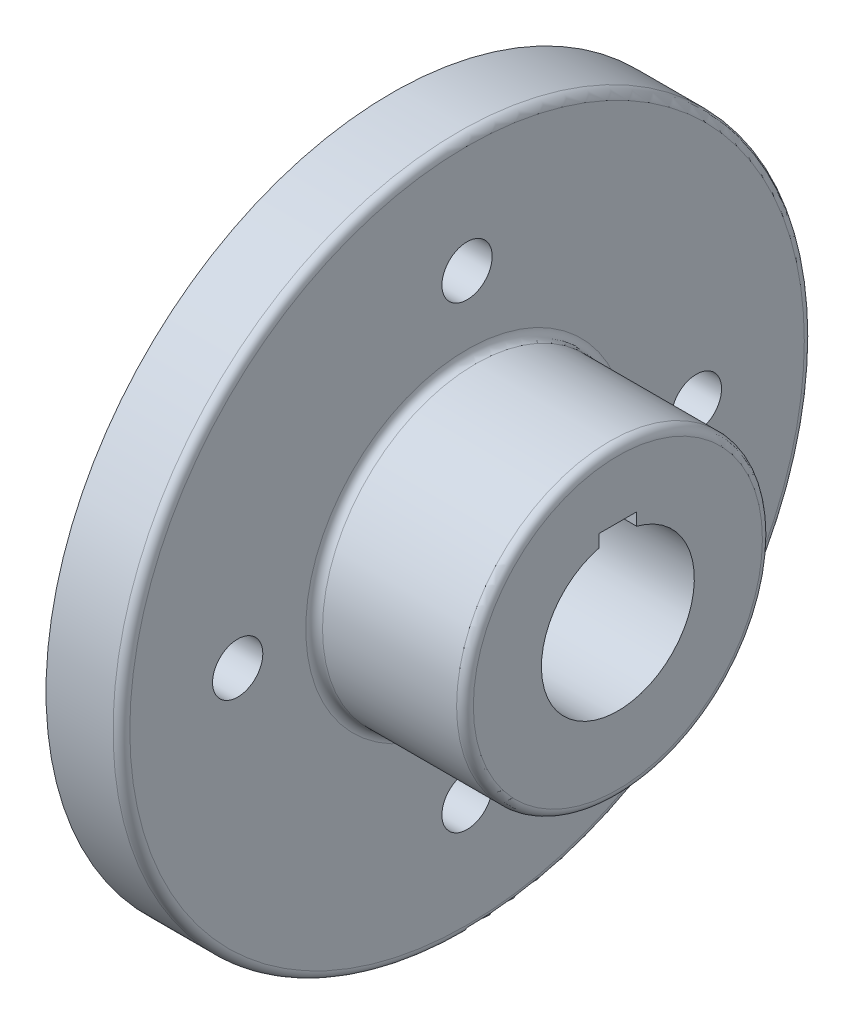
ISO-10303-21;
HEADER;
FILE_DESCRIPTION(('STEP AP214'),'2;1');
FILE_NAME('part.step','',(''),(''),'','','');
FILE_SCHEMA(('AUTOMOTIVE_DESIGN { 1 0 10303 214 1 1 1 1 }'));
ENDSEC;
DATA;
#1=APPLICATION_CONTEXT('core data for automotive mechanical design processes');
#2=APPLICATION_PROTOCOL_DEFINITION('international standard','automotive_design',2000,#1);
#3=PRODUCT_CONTEXT('',#1,'mechanical');
#4=PRODUCT('Part','Part','',(#3));
#5=PRODUCT_RELATED_PRODUCT_CATEGORY('part','',(#4));
#6=PRODUCT_DEFINITION_FORMATION('','',#4);
#7=PRODUCT_DEFINITION_CONTEXT('part definition',#1,'design');
#8=PRODUCT_DEFINITION('design','',#6,#7);
#9=PRODUCT_DEFINITION_SHAPE('','',#8);
#10=(LENGTH_UNIT() NAMED_UNIT(*) SI_UNIT(.MILLI.,.METRE.));
#11=(NAMED_UNIT(*) PLANE_ANGLE_UNIT() SI_UNIT($,.RADIAN.));
#12=(NAMED_UNIT(*) SI_UNIT($,.STERADIAN.) SOLID_ANGLE_UNIT());
#13=UNCERTAINTY_MEASURE_WITH_UNIT(LENGTH_MEASURE(1.E-05),#10,'distance_accuracy_value','');
#14=(GEOMETRIC_REPRESENTATION_CONTEXT(3) GLOBAL_UNCERTAINTY_ASSIGNED_CONTEXT((#13)) GLOBAL_UNIT_ASSIGNED_CONTEXT((#10,
#11,#12)) REPRESENTATION_CONTEXT('',''));
#15=CARTESIAN_POINT('',(0.,0.,0.));
#16=DIRECTION('',(0.,0.,1.));
#17=DIRECTION('',(1.,0.,0.));
#18=AXIS2_PLACEMENT_3D('',#15,#16,#17);
#19=CARTESIAN_POINT('',(18.,0.,0.));
#20=DIRECTION('',(-1.,0.,0.));
#21=DIRECTION('',(0.,0.,1.));
#22=AXIS2_PLACEMENT_3D('',#19,#20,#21);
#23=CYLINDRICAL_SURFACE('',#22,82.5);
#24=CARTESIAN_POINT('',(16.,0.,0.));
#25=DIRECTION('',(1.,0.,0.));
#26=DIRECTION('',(0.,0.,-1.));
#27=AXIS2_PLACEMENT_3D('',#24,#25,#26);
#28=CIRCLE('',#27,82.5);
#29=CARTESIAN_POINT('',(16.,0.,-82.5));
#30=VERTEX_POINT('',#29);
#31=EDGE_CURVE('E132',#30,#30,#28,.F.);
#32=ORIENTED_EDGE('',*,*,#31,.T.);
#33=EDGE_LOOP('',(#32));
#34=FACE_BOUND('',#33,.T.);
#35=CARTESIAN_POINT('',(0.,0.,0.));
#36=DIRECTION('',(1.,0.,0.));
#37=DIRECTION('',(0.,0.,-1.));
#38=AXIS2_PLACEMENT_3D('',#35,#36,#37);
#39=CIRCLE('',#38,82.5);
#40=CARTESIAN_POINT('',(0.,0.,-82.5));
#41=VERTEX_POINT('',#40);
#42=EDGE_CURVE('E113',#41,#41,#39,.T.);
#43=ORIENTED_EDGE('',*,*,#42,.T.);
#44=EDGE_LOOP('',(#43));
#45=FACE_BOUND('',#44,.T.);
#46=ADVANCED_FACE('F43',(#34,#45),#23,.T.);
#47=CARTESIAN_POINT('',(18.,0.,0.));
#48=DIRECTION('',(1.,0.,0.));
#49=DIRECTION('',(0.,0.,-1.));
#50=AXIS2_PLACEMENT_3D('',#47,#48,#49);
#51=PLANE('',#50);
#52=CARTESIAN_POINT('',(18.,0.,0.));
#53=DIRECTION('',(1.,0.,0.));
#54=DIRECTION('',(0.,0.,-1.));
#55=AXIS2_PLACEMENT_3D('',#52,#53,#54);
#56=CIRCLE('',#55,80.5);
#57=CARTESIAN_POINT('',(18.,0.,-80.5));
#58=VERTEX_POINT('',#57);
#59=EDGE_CURVE('E128',#58,#58,#56,.T.);
#60=ORIENTED_EDGE('',*,*,#59,.T.);
#61=EDGE_LOOP('',(#60));
#62=FACE_BOUND('',#61,.T.);
#63=CARTESIAN_POINT('',(18.,0.,0.));
#64=DIRECTION('',(1.,0.,0.));
#65=DIRECTION('',(0.,0.,-1.));
#66=AXIS2_PLACEMENT_3D('',#63,#64,#65);
#67=CIRCLE('',#66,38.5);
#68=CARTESIAN_POINT('',(18.,0.,-38.5));
#69=VERTEX_POINT('',#68);
#70=EDGE_CURVE('E118',#69,#69,#67,.F.);
#71=ORIENTED_EDGE('',*,*,#70,.T.);
#72=EDGE_LOOP('',(#71));
#73=FACE_BOUND('',#72,.T.);
#74=CARTESIAN_POINT('',(18.,-54.75,0.));
#75=DIRECTION('',(1.,0.,0.));
#76=DIRECTION('',(0.,0.,-1.));
#77=AXIS2_PLACEMENT_3D('',#74,#75,#76);
#78=CIRCLE('',#77,6.);
#79=CARTESIAN_POINT('',(18.,-54.75,-5.99999999999999));
#80=VERTEX_POINT('',#79);
#81=EDGE_CURVE('E120',#80,#80,#78,.T.);
#82=ORIENTED_EDGE('',*,*,#81,.F.);
#83=EDGE_LOOP('',(#82));
#84=FACE_BOUND('',#83,.T.);
#85=CARTESIAN_POINT('',(18.,1.8445366207633E-13,-54.75));
#86=DIRECTION('',(1.,0.,0.));
#87=DIRECTION('',(0.,0.,-1.));
#88=AXIS2_PLACEMENT_3D('',#85,#86,#87);
#89=CIRCLE('',#88,6.);
#90=CARTESIAN_POINT('',(18.,1.8445366207633E-13,-60.75));
#91=VERTEX_POINT('',#90);
#92=EDGE_CURVE('E246',#91,#91,#89,.T.);
#93=ORIENTED_EDGE('',*,*,#92,.F.);
#94=EDGE_LOOP('',(#93));
#95=FACE_BOUND('',#94,.T.);
#96=CARTESIAN_POINT('',(18.,54.75,3.75612265377991E-13));
#97=DIRECTION('',(1.,0.,0.));
#98=DIRECTION('',(0.,0.,-1.));
#99=AXIS2_PLACEMENT_3D('',#96,#97,#98);
#100=CIRCLE('',#99,6.);
#101=CARTESIAN_POINT('',(18.,54.75,-5.99999999999962));
#102=VERTEX_POINT('',#101);
#103=EDGE_CURVE('E243',#102,#102,#100,.T.);
#104=ORIENTED_EDGE('',*,*,#103,.F.);
#105=EDGE_LOOP('',(#104));
#106=FACE_BOUND('',#105,.T.);
#107=CARTESIAN_POINT('',(18.,-5.66770868679653E-13,54.75));
#108=DIRECTION('',(1.,0.,0.));
#109=DIRECTION('',(0.,0.,-1.));
#110=AXIS2_PLACEMENT_3D('',#107,#108,#109);
#111=CIRCLE('',#110,6.);
#112=CARTESIAN_POINT('',(18.,-5.66770868679653E-13,48.75));
#113=VERTEX_POINT('',#112);
#114=EDGE_CURVE('E228',#113,#113,#111,.T.);
#115=ORIENTED_EDGE('',*,*,#114,.F.);
#116=EDGE_LOOP('',(#115));
#117=FACE_BOUND('',#116,.T.);
#118=ADVANCED_FACE('F161',(#62,#73,#84,#95,#106,#117),#51,.T.);
#119=CARTESIAN_POINT('',(0.,0.,0.));
#120=DIRECTION('',(1.,0.,0.));
#121=DIRECTION('',(0.,0.,-1.));
#122=AXIS2_PLACEMENT_3D('',#119,#120,#121);
#123=PLANE('',#122);
#124=CARTESIAN_POINT('',(0.,-54.75,0.));
#125=DIRECTION('',(-1.,0.,0.));
#126=DIRECTION('',(0.,0.,1.));
#127=AXIS2_PLACEMENT_3D('',#124,#125,#126);
#128=CIRCLE('',#127,6.);
#129=CARTESIAN_POINT('',(0.,-54.75,6.00000000000001));
#130=VERTEX_POINT('',#129);
#131=EDGE_CURVE('E224',#130,#130,#128,.T.);
#132=ORIENTED_EDGE('',*,*,#131,.F.);
#133=EDGE_LOOP('',(#132));
#134=FACE_BOUND('',#133,.T.);
#135=CARTESIAN_POINT('',(0.,1.8445366207633E-13,-54.75));
#136=DIRECTION('',(-1.,0.,0.));
#137=DIRECTION('',(0.,0.,1.));
#138=AXIS2_PLACEMENT_3D('',#135,#136,#137);
#139=CIRCLE('',#138,6.);
#140=CARTESIAN_POINT('',(0.,1.8445366207633E-13,-48.75));
#141=VERTEX_POINT('',#140);
#142=EDGE_CURVE('E229',#141,#141,#139,.T.);
#143=ORIENTED_EDGE('',*,*,#142,.F.);
#144=EDGE_LOOP('',(#143));
#145=FACE_BOUND('',#144,.T.);
#146=CARTESIAN_POINT('',(0.,54.75,3.75612265377991E-13));
#147=DIRECTION('',(-1.,0.,0.));
#148=DIRECTION('',(0.,0.,1.));
#149=AXIS2_PLACEMENT_3D('',#146,#147,#148);
#150=CIRCLE('',#149,6.);
#151=CARTESIAN_POINT('',(0.,54.75,6.00000000000037));
#152=VERTEX_POINT('',#151);
#153=EDGE_CURVE('E233',#152,#152,#150,.T.);
#154=ORIENTED_EDGE('',*,*,#153,.F.);
#155=EDGE_LOOP('',(#154));
#156=FACE_BOUND('',#155,.T.);
#157=CARTESIAN_POINT('',(0.,-5.66770868679653E-13,54.75));
#158=DIRECTION('',(-1.,0.,0.));
#159=DIRECTION('',(0.,0.,1.));
#160=AXIS2_PLACEMENT_3D('',#157,#158,#159);
#161=CIRCLE('',#160,6.);
#162=CARTESIAN_POINT('',(0.,-5.66770868679653E-13,60.75));
#163=VERTEX_POINT('',#162);
#164=EDGE_CURVE('E219',#163,#163,#161,.T.);
#165=ORIENTED_EDGE('',*,*,#164,.F.);
#166=EDGE_LOOP('',(#165));
#167=FACE_BOUND('',#166,.T.);
#168=CARTESIAN_POINT('',(0.,0.,0.));
#169=DIRECTION('',(-1.,0.,0.));
#170=DIRECTION('',(0.,0.,1.));
#171=AXIS2_PLACEMENT_3D('',#168,#169,#170);
#172=CIRCLE('',#171,18.25);
#173=CARTESIAN_POINT('',(0.,17.686506155824,-4.50000000000001));
#174=VERTEX_POINT('',#173);
#175=CARTESIAN_POINT('',(0.,17.686506155824,4.5));
#176=VERTEX_POINT('',#175);
#177=EDGE_CURVE('E107',#174,#176,#172,.T.);
#178=ORIENTED_EDGE('',*,*,#177,.F.);
#179=DIRECTION('',(0.,-1.,0.));
#180=VECTOR('',#179,1.);
#181=CARTESIAN_POINT('',(0.,20.686506155824,-4.5));
#182=LINE('',#181,#180);
#183=CARTESIAN_POINT('',(0.,20.686506155824,-4.5));
#184=VERTEX_POINT('',#183);
#185=EDGE_CURVE('E59',#184,#174,#182,.T.);
#186=ORIENTED_EDGE('',*,*,#185,.F.);
#187=DIRECTION('',(0.,0.,-1.));
#188=VECTOR('',#187,1.);
#189=CARTESIAN_POINT('',(0.,20.686506155824,-4.5));
#190=LINE('',#189,#188);
#191=CARTESIAN_POINT('',(0.,20.686506155824,4.5));
#192=VERTEX_POINT('',#191);
#193=EDGE_CURVE('E205',#192,#184,#190,.T.);
#194=ORIENTED_EDGE('',*,*,#193,.F.);
#195=DIRECTION('',(0.,1.,0.));
#196=VECTOR('',#195,1.);
#197=CARTESIAN_POINT('',(0.,20.686506155824,4.5));
#198=LINE('',#197,#196);
#199=EDGE_CURVE('E208',#176,#192,#198,.T.);
#200=ORIENTED_EDGE('',*,*,#199,.F.);
#201=EDGE_LOOP('',(#178,#186,#194,#200));
#202=FACE_BOUND('',#201,.T.);
#203=ORIENTED_EDGE('',*,*,#42,.F.);
#204=EDGE_LOOP('',(#203));
#205=FACE_BOUND('',#204,.T.);
#206=ADVANCED_FACE('F167',(#134,#145,#156,#167,#202,#205),#123,.F.);
#207=CARTESIAN_POINT('',(54.,0.,0.));
#208=DIRECTION('',(-1.,0.,0.));
#209=DIRECTION('',(0.,0.,1.));
#210=AXIS2_PLACEMENT_3D('',#207,#208,#209);
#211=CYLINDRICAL_SURFACE('',#210,36.5);
#212=CARTESIAN_POINT('',(20.,0.,0.));
#213=DIRECTION('',(1.,0.,0.));
#214=DIRECTION('',(0.,0.,-1.));
#215=AXIS2_PLACEMENT_3D('',#212,#213,#214);
#216=CIRCLE('',#215,36.5);
#217=CARTESIAN_POINT('',(20.,0.,-36.5));
#218=VERTEX_POINT('',#217);
#219=EDGE_CURVE('E52',#218,#218,#216,.T.);
#220=ORIENTED_EDGE('',*,*,#219,.T.);
#221=EDGE_LOOP('',(#220));
#222=FACE_BOUND('',#221,.T.);
#223=CARTESIAN_POINT('',(52.,0.,0.));
#224=DIRECTION('',(1.,0.,0.));
#225=DIRECTION('',(0.,0.,-1.));
#226=AXIS2_PLACEMENT_3D('',#223,#224,#225);
#227=CIRCLE('',#226,36.5);
#228=CARTESIAN_POINT('',(52.,0.,-36.5));
#229=VERTEX_POINT('',#228);
#230=EDGE_CURVE('E136',#229,#229,#227,.F.);
#231=ORIENTED_EDGE('',*,*,#230,.T.);
#232=EDGE_LOOP('',(#231));
#233=FACE_BOUND('',#232,.T.);
#234=ADVANCED_FACE('F143',(#222,#233),#211,.T.);
#235=CARTESIAN_POINT('',(54.,0.,0.));
#236=DIRECTION('',(1.,0.,0.));
#237=DIRECTION('',(0.,0.,-1.));
#238=AXIS2_PLACEMENT_3D('',#235,#236,#237);
#239=PLANE('',#238);
#240=DIRECTION('',(0.,-1.,0.));
#241=VECTOR('',#240,1.);
#242=CARTESIAN_POINT('',(54.,20.686506155824,-4.5));
#243=LINE('',#242,#241);
#244=CARTESIAN_POINT('',(54.,20.686506155824,-4.5));
#245=VERTEX_POINT('',#244);
#246=CARTESIAN_POINT('',(54.,17.686506155824,-4.5));
#247=VERTEX_POINT('',#246);
#248=EDGE_CURVE('E99',#245,#247,#243,.T.);
#249=ORIENTED_EDGE('',*,*,#248,.T.);
#250=CARTESIAN_POINT('',(54.,0.,0.));
#251=DIRECTION('',(-1.,0.,0.));
#252=DIRECTION('',(0.,0.,1.));
#253=AXIS2_PLACEMENT_3D('',#250,#251,#252);
#254=CIRCLE('',#253,18.25);
#255=CARTESIAN_POINT('',(54.,17.686506155824,4.5));
#256=VERTEX_POINT('',#255);
#257=EDGE_CURVE('E105',#247,#256,#254,.T.);
#258=ORIENTED_EDGE('',*,*,#257,.T.);
#259=DIRECTION('',(0.,1.,0.));
#260=VECTOR('',#259,1.);
#261=CARTESIAN_POINT('',(54.,20.686506155824,4.5));
#262=LINE('',#261,#260);
#263=CARTESIAN_POINT('',(54.,20.686506155824,4.5));
#264=VERTEX_POINT('',#263);
#265=EDGE_CURVE('E87',#256,#264,#262,.T.);
#266=ORIENTED_EDGE('',*,*,#265,.T.);
#267=DIRECTION('',(0.,0.,-1.));
#268=VECTOR('',#267,1.);
#269=CARTESIAN_POINT('',(54.,20.686506155824,-4.5));
#270=LINE('',#269,#268);
#271=EDGE_CURVE('E98',#264,#245,#270,.T.);
#272=ORIENTED_EDGE('',*,*,#271,.T.);
#273=EDGE_LOOP('',(#249,#258,#266,#272));
#274=FACE_BOUND('',#273,.T.);
#275=CARTESIAN_POINT('',(54.,0.,0.));
#276=DIRECTION('',(1.,0.,0.));
#277=DIRECTION('',(0.,0.,-1.));
#278=AXIS2_PLACEMENT_3D('',#275,#276,#277);
#279=CIRCLE('',#278,34.5);
#280=CARTESIAN_POINT('',(54.,0.,-34.5));
#281=VERTEX_POINT('',#280);
#282=EDGE_CURVE('E11',#281,#281,#279,.T.);
#283=ORIENTED_EDGE('',*,*,#282,.T.);
#284=EDGE_LOOP('',(#283));
#285=FACE_BOUND('',#284,.T.);
#286=ADVANCED_FACE('F110',(#274,#285),#239,.T.);
#287=CARTESIAN_POINT('',(54.,0.,0.));
#288=DIRECTION('',(-1.,0.,0.));
#289=DIRECTION('',(0.,0.,1.));
#290=AXIS2_PLACEMENT_3D('',#287,#288,#289);
#291=CYLINDRICAL_SURFACE('',#290,18.25);
#292=ORIENTED_EDGE('',*,*,#177,.T.);
#293=DIRECTION('',(-1.,0.,0.));
#294=VECTOR('',#293,1.);
#295=CARTESIAN_POINT('',(54.,17.686506155824,4.5));
#296=LINE('',#295,#294);
#297=EDGE_CURVE('E91',#256,#176,#296,.T.);
#298=ORIENTED_EDGE('',*,*,#297,.F.);
#299=ORIENTED_EDGE('',*,*,#257,.F.);
#300=DIRECTION('',(-1.,0.,0.));
#301=VECTOR('',#300,1.);
#302=CARTESIAN_POINT('',(54.,17.686506155824,-4.5));
#303=LINE('',#302,#301);
#304=EDGE_CURVE('E82',#247,#174,#303,.T.);
#305=ORIENTED_EDGE('',*,*,#304,.T.);
#306=EDGE_LOOP('',(#292,#298,#299,#305));
#307=FACE_BOUND('',#306,.T.);
#308=ADVANCED_FACE('F104',(#307),#291,.F.);
#309=CARTESIAN_POINT('',(54.,-5.66770868679653E-13,54.75));
#310=DIRECTION('',(-1.,0.,0.));
#311=DIRECTION('',(0.,0.,1.));
#312=AXIS2_PLACEMENT_3D('',#309,#310,#311);
#313=CYLINDRICAL_SURFACE('',#312,6.);
#314=ORIENTED_EDGE('',*,*,#114,.T.);
#315=EDGE_LOOP('',(#314));
#316=FACE_BOUND('',#315,.T.);
#317=ORIENTED_EDGE('',*,*,#164,.T.);
#318=EDGE_LOOP('',(#317));
#319=FACE_BOUND('',#318,.T.);
#320=ADVANCED_FACE('F181',(#316,#319),#313,.F.);
#321=CARTESIAN_POINT('',(54.,54.75,3.75612265377991E-13));
#322=DIRECTION('',(-1.,0.,0.));
#323=DIRECTION('',(0.,0.,1.));
#324=AXIS2_PLACEMENT_3D('',#321,#322,#323);
#325=CYLINDRICAL_SURFACE('',#324,6.);
#326=ORIENTED_EDGE('',*,*,#103,.T.);
#327=EDGE_LOOP('',(#326));
#328=FACE_BOUND('',#327,.T.);
#329=ORIENTED_EDGE('',*,*,#153,.T.);
#330=EDGE_LOOP('',(#329));
#331=FACE_BOUND('',#330,.T.);
#332=ADVANCED_FACE('F184',(#328,#331),#325,.F.);
#333=CARTESIAN_POINT('',(54.,1.8445366207633E-13,-54.75));
#334=DIRECTION('',(-1.,0.,0.));
#335=DIRECTION('',(0.,0.,1.));
#336=AXIS2_PLACEMENT_3D('',#333,#334,#335);
#337=CYLINDRICAL_SURFACE('',#336,6.);
#338=ORIENTED_EDGE('',*,*,#92,.T.);
#339=EDGE_LOOP('',(#338));
#340=FACE_BOUND('',#339,.T.);
#341=ORIENTED_EDGE('',*,*,#142,.T.);
#342=EDGE_LOOP('',(#341));
#343=FACE_BOUND('',#342,.T.);
#344=ADVANCED_FACE('F188',(#340,#343),#337,.F.);
#345=CARTESIAN_POINT('',(54.,-54.75,0.));
#346=DIRECTION('',(-1.,0.,0.));
#347=DIRECTION('',(0.,0.,1.));
#348=AXIS2_PLACEMENT_3D('',#345,#346,#347);
#349=CYLINDRICAL_SURFACE('',#348,6.);
#350=ORIENTED_EDGE('',*,*,#81,.T.);
#351=EDGE_LOOP('',(#350));
#352=FACE_BOUND('',#351,.T.);
#353=ORIENTED_EDGE('',*,*,#131,.T.);
#354=EDGE_LOOP('',(#353));
#355=FACE_BOUND('',#354,.T.);
#356=ADVANCED_FACE('F156',(#352,#355),#349,.F.);
#357=CARTESIAN_POINT('',(16.,0.,0.));
#358=DIRECTION('',(1.,0.,0.));
#359=DIRECTION('',(0.,0.,-1.));
#360=AXIS2_PLACEMENT_3D('',#357,#358,#359);
#361=TOROIDAL_SURFACE('',#360,80.5,2.);
#362=ORIENTED_EDGE('',*,*,#31,.F.);
#363=EDGE_LOOP('',(#362));
#364=FACE_BOUND('',#363,.T.);
#365=ORIENTED_EDGE('',*,*,#59,.F.);
#366=EDGE_LOOP('',(#365));
#367=FACE_BOUND('',#366,.T.);
#368=ADVANCED_FACE('F148',(#364,#367),#361,.T.);
#369=CARTESIAN_POINT('',(20.,0.,0.));
#370=DIRECTION('',(1.,0.,0.));
#371=DIRECTION('',(0.,0.,-1.));
#372=AXIS2_PLACEMENT_3D('',#369,#370,#371);
#373=TOROIDAL_SURFACE('',#372,38.5,2.);
#374=ORIENTED_EDGE('',*,*,#70,.F.);
#375=EDGE_LOOP('',(#374));
#376=FACE_BOUND('',#375,.T.);
#377=ORIENTED_EDGE('',*,*,#219,.F.);
#378=EDGE_LOOP('',(#377));
#379=FACE_BOUND('',#378,.T.);
#380=ADVANCED_FACE('F146',(#376,#379),#373,.F.);
#381=CARTESIAN_POINT('',(52.,0.,0.));
#382=DIRECTION('',(1.,0.,0.));
#383=DIRECTION('',(0.,0.,-1.));
#384=AXIS2_PLACEMENT_3D('',#381,#382,#383);
#385=TOROIDAL_SURFACE('',#384,34.5,2.);
#386=ORIENTED_EDGE('',*,*,#230,.F.);
#387=EDGE_LOOP('',(#386));
#388=FACE_BOUND('',#387,.T.);
#389=ORIENTED_EDGE('',*,*,#282,.F.);
#390=EDGE_LOOP('',(#389));
#391=FACE_BOUND('',#390,.T.);
#392=ADVANCED_FACE('F45',(#388,#391),#385,.T.);
#393=CARTESIAN_POINT('',(54.,20.686506155824,-4.5));
#394=DIRECTION('',(0.,0.,-1.));
#395=DIRECTION('',(0.,1.,0.));
#396=AXIS2_PLACEMENT_3D('',#393,#394,#395);
#397=PLANE('',#396);
#398=ORIENTED_EDGE('',*,*,#185,.T.);
#399=ORIENTED_EDGE('',*,*,#304,.F.);
#400=ORIENTED_EDGE('',*,*,#248,.F.);
#401=DIRECTION('',(-1.,0.,0.));
#402=VECTOR('',#401,1.);
#403=CARTESIAN_POINT('',(54.,20.686506155824,-4.5));
#404=LINE('',#403,#402);
#405=EDGE_CURVE('E67',#245,#184,#404,.T.);
#406=ORIENTED_EDGE('',*,*,#405,.T.);
#407=EDGE_LOOP('',(#398,#399,#400,#406));
#408=FACE_BOUND('',#407,.T.);
#409=ADVANCED_FACE('F154',(#408),#397,.F.);
#410=CARTESIAN_POINT('',(54.,20.686506155824,-4.5));
#411=DIRECTION('',(0.,1.,0.));
#412=DIRECTION('',(0.,0.,1.));
#413=AXIS2_PLACEMENT_3D('',#410,#411,#412);
#414=PLANE('',#413);
#415=ORIENTED_EDGE('',*,*,#193,.T.);
#416=ORIENTED_EDGE('',*,*,#405,.F.);
#417=ORIENTED_EDGE('',*,*,#271,.F.);
#418=DIRECTION('',(-1.,0.,0.));
#419=VECTOR('',#418,1.);
#420=CARTESIAN_POINT('',(54.,20.686506155824,4.5));
#421=LINE('',#420,#419);
#422=EDGE_CURVE('E93',#264,#192,#421,.T.);
#423=ORIENTED_EDGE('',*,*,#422,.T.);
#424=EDGE_LOOP('',(#415,#416,#417,#423));
#425=FACE_BOUND('',#424,.T.);
#426=ADVANCED_FACE('F198',(#425),#414,.F.);
#427=CARTESIAN_POINT('',(54.,20.686506155824,4.5));
#428=DIRECTION('',(0.,0.,1.));
#429=DIRECTION('',(1.,0.,0.));
#430=AXIS2_PLACEMENT_3D('',#427,#428,#429);
#431=PLANE('',#430);
#432=ORIENTED_EDGE('',*,*,#199,.T.);
#433=ORIENTED_EDGE('',*,*,#422,.F.);
#434=ORIENTED_EDGE('',*,*,#265,.F.);
#435=ORIENTED_EDGE('',*,*,#297,.T.);
#436=EDGE_LOOP('',(#432,#433,#434,#435));
#437=FACE_BOUND('',#436,.T.);
#438=ADVANCED_FACE('F90',(#437),#431,.F.);
#439=CLOSED_SHELL('',(#46,#118,#206,#234,#286,#308,#320,#332,#344,#356,#368,#380,#392,#409,#426,#438));
#440=MANIFOLD_SOLID_BREP('B2',#439);
#441=ADVANCED_BREP_SHAPE_REPRESENTATION('',(#18,#440),#14);
#442=SHAPE_DEFINITION_REPRESENTATION(#9,#441);
ENDSEC;
END-ISO-10303-21;
